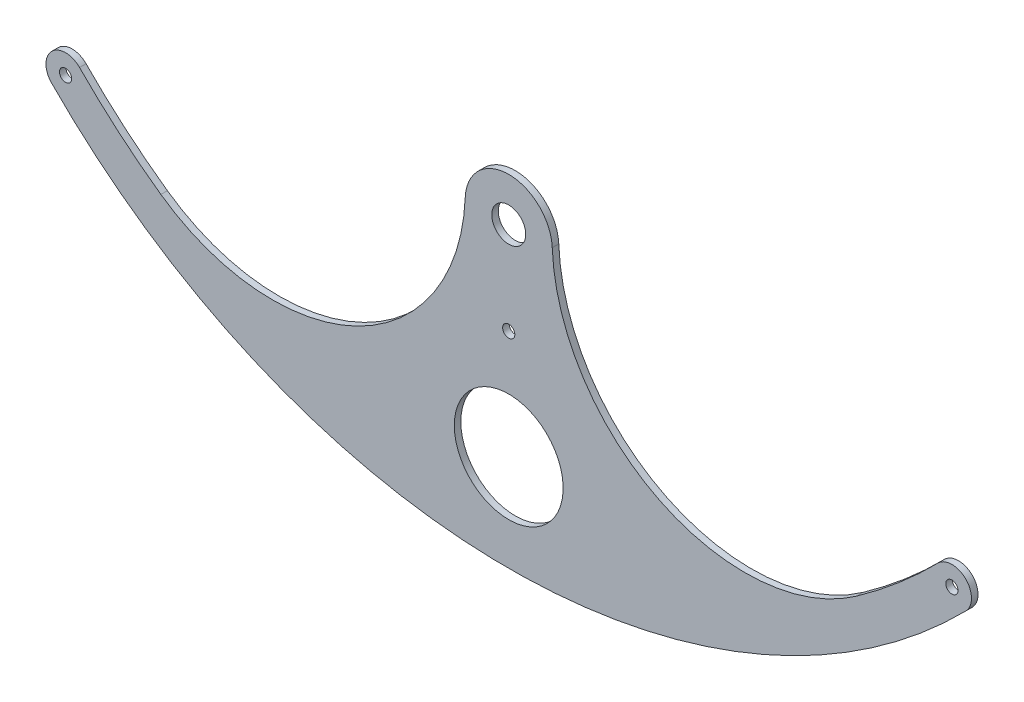
ISO-10303-21;
HEADER;
FILE_DESCRIPTION(('STEP AP214'),'2;1');
FILE_NAME('part.step','',(''),(''),'','','');
FILE_SCHEMA(('AUTOMOTIVE_DESIGN { 1 0 10303 214 1 1 1 1 }'));
ENDSEC;
DATA;
#1=APPLICATION_CONTEXT('core data for automotive mechanical design processes');
#2=APPLICATION_PROTOCOL_DEFINITION('international standard','automotive_design',2000,#1);
#3=PRODUCT_CONTEXT('',#1,'mechanical');
#4=PRODUCT('Part','Part','',(#3));
#5=PRODUCT_RELATED_PRODUCT_CATEGORY('part','',(#4));
#6=PRODUCT_DEFINITION_FORMATION('','',#4);
#7=PRODUCT_DEFINITION_CONTEXT('part definition',#1,'design');
#8=PRODUCT_DEFINITION('design','',#6,#7);
#9=PRODUCT_DEFINITION_SHAPE('','',#8);
#10=(LENGTH_UNIT() NAMED_UNIT(*) SI_UNIT(.MILLI.,.METRE.));
#11=(NAMED_UNIT(*) PLANE_ANGLE_UNIT() SI_UNIT($,.RADIAN.));
#12=(NAMED_UNIT(*) SI_UNIT($,.STERADIAN.) SOLID_ANGLE_UNIT());
#13=UNCERTAINTY_MEASURE_WITH_UNIT(LENGTH_MEASURE(1.E-05),#10,'distance_accuracy_value','');
#14=(GEOMETRIC_REPRESENTATION_CONTEXT(3) GLOBAL_UNCERTAINTY_ASSIGNED_CONTEXT((#13)) GLOBAL_UNIT_ASSIGNED_CONTEXT((#10,
#11,#12)) REPRESENTATION_CONTEXT('',''));
#15=CARTESIAN_POINT('',(0.,0.,0.));
#16=DIRECTION('',(0.,0.,1.));
#17=DIRECTION('',(1.,0.,0.));
#18=AXIS2_PLACEMENT_3D('',#15,#16,#17);
#19=CARTESIAN_POINT('',(0.,127.,1.905));
#20=DIRECTION('',(0.,0.,-1.));
#21=DIRECTION('',(-1.,0.,0.));
#22=AXIS2_PLACEMENT_3D('',#19,#20,#21);
#23=CYLINDRICAL_SURFACE('',#22,175.513777505119);
#24=CARTESIAN_POINT('',(0.,127.,0.));
#25=DIRECTION('',(0.,0.,1.));
#26=DIRECTION('',(1.,0.,0.));
#27=AXIS2_PLACEMENT_3D('',#24,#25,#26);
#28=CIRCLE('',#27,175.513777505119);
#29=CARTESIAN_POINT('',(101.478252071393,-16.2035280663547,0.));
#30=VERTEX_POINT('',#29);
#31=CARTESIAN_POINT('',(125.209001301605,4.00491031276475,0.));
#32=VERTEX_POINT('',#31);
#33=EDGE_CURVE('E152',#30,#32,#28,.T.);
#34=ORIENTED_EDGE('',*,*,#33,.F.);
#35=DIRECTION('',(0.,0.,-1.));
#36=VECTOR('',#35,1.);
#37=CARTESIAN_POINT('',(101.478252071393,-16.2035280663547,1.905));
#38=LINE('',#37,#36);
#39=CARTESIAN_POINT('',(101.478252071393,-16.2035280663547,1.905));
#40=VERTEX_POINT('',#39);
#41=EDGE_CURVE('E11',#40,#30,#38,.T.);
#42=ORIENTED_EDGE('',*,*,#41,.F.);
#43=CARTESIAN_POINT('',(0.,127.,1.905));
#44=DIRECTION('',(0.,0.,1.));
#45=DIRECTION('',(1.,0.,0.));
#46=AXIS2_PLACEMENT_3D('',#43,#44,#45);
#47=CIRCLE('',#46,175.513777505119);
#48=CARTESIAN_POINT('',(125.209001301605,4.00491031276475,1.905));
#49=VERTEX_POINT('',#48);
#50=EDGE_CURVE('E246',#40,#49,#47,.T.);
#51=ORIENTED_EDGE('',*,*,#50,.T.);
#52=DIRECTION('',(0.,0.,-1.));
#53=VECTOR('',#52,1.);
#54=CARTESIAN_POINT('',(125.209001301605,4.00491031276475,1.905));
#55=LINE('',#54,#53);
#56=EDGE_CURVE('E86',#49,#32,#55,.T.);
#57=ORIENTED_EDGE('',*,*,#56,.T.);
#58=EDGE_LOOP('',(#34,#42,#51,#57));
#59=FACE_BOUND('',#58,.T.);
#60=ADVANCED_FACE('F35',(#59),#23,.F.);
#61=CARTESIAN_POINT('',(68.9328054540609,29.7237783560926,1.905));
#62=DIRECTION('',(0.,0.,-1.));
#63=DIRECTION('',(-1.,0.,0.));
#64=AXIS2_PLACEMENT_3D('',#61,#62,#63);
#65=CYLINDRICAL_SURFACE('',#64,56.2896399947894);
#66=CARTESIAN_POINT('',(68.9328054540609,29.7237783560926,0.));
#67=DIRECTION('',(0.,0.,1.));
#68=DIRECTION('',(1.,0.,0.));
#69=AXIS2_PLACEMENT_3D('',#66,#67,#68);
#70=CIRCLE('',#69,56.2896399947894);
#71=CARTESIAN_POINT('',(12.6895375788697,27.4393989080833,0.));
#72=VERTEX_POINT('',#71);
#73=EDGE_CURVE('E150',#30,#72,#70,.F.);
#74=ORIENTED_EDGE('',*,*,#73,.T.);
#75=DIRECTION('',(0.,0.,-1.));
#76=VECTOR('',#75,1.);
#77=CARTESIAN_POINT('',(12.6895375788697,27.4393989080833,1.905));
#78=LINE('',#77,#76);
#79=CARTESIAN_POINT('',(12.6895375788697,27.4393989080833,1.905));
#80=VERTEX_POINT('',#79);
#81=EDGE_CURVE('E44',#80,#72,#78,.T.);
#82=ORIENTED_EDGE('',*,*,#81,.F.);
#83=CARTESIAN_POINT('',(68.9328054540609,29.7237783560926,1.905));
#84=DIRECTION('',(0.,0.,1.));
#85=DIRECTION('',(1.,0.,0.));
#86=AXIS2_PLACEMENT_3D('',#83,#84,#85);
#87=CIRCLE('',#86,56.2896399947894);
#88=EDGE_CURVE('E248',#40,#80,#87,.F.);
#89=ORIENTED_EDGE('',*,*,#88,.F.);
#90=ORIENTED_EDGE('',*,*,#41,.T.);
#91=EDGE_LOOP('',(#74,#82,#89,#90));
#92=FACE_BOUND('',#91,.T.);
#93=ADVANCED_FACE('F151',(#92),#65,.F.);
#94=CARTESIAN_POINT('',(0.,26.924,1.905));
#95=DIRECTION('',(0.,0.,-1.));
#96=DIRECTION('',(-1.,0.,0.));
#97=AXIS2_PLACEMENT_3D('',#94,#95,#96);
#98=CYLINDRICAL_SURFACE('',#97,12.7);
#99=CARTESIAN_POINT('',(0.,26.924,0.));
#100=DIRECTION('',(0.,0.,1.));
#101=DIRECTION('',(1.,0.,0.));
#102=AXIS2_PLACEMENT_3D('',#99,#100,#101);
#103=CIRCLE('',#102,12.7);
#104=CARTESIAN_POINT('',(-12.6895375788697,27.4393989080833,0.));
#105=VERTEX_POINT('',#104);
#106=EDGE_CURVE('E144',#72,#105,#103,.T.);
#107=ORIENTED_EDGE('',*,*,#106,.T.);
#108=DIRECTION('',(0.,0.,-1.));
#109=VECTOR('',#108,1.);
#110=CARTESIAN_POINT('',(-12.6895375788697,27.4393989080833,1.905));
#111=LINE('',#110,#109);
#112=CARTESIAN_POINT('',(-12.6895375788697,27.4393989080833,1.905));
#113=VERTEX_POINT('',#112);
#114=EDGE_CURVE('E136',#113,#105,#111,.T.);
#115=ORIENTED_EDGE('',*,*,#114,.F.);
#116=CARTESIAN_POINT('',(0.,26.924,1.905));
#117=DIRECTION('',(0.,0.,1.));
#118=DIRECTION('',(1.,0.,0.));
#119=AXIS2_PLACEMENT_3D('',#116,#117,#118);
#120=CIRCLE('',#119,12.7);
#121=EDGE_CURVE('E146',#80,#113,#120,.T.);
#122=ORIENTED_EDGE('',*,*,#121,.F.);
#123=ORIENTED_EDGE('',*,*,#81,.T.);
#124=EDGE_LOOP('',(#107,#115,#122,#123));
#125=FACE_BOUND('',#124,.T.);
#126=ADVANCED_FACE('F142',(#125),#98,.T.);
#127=CARTESIAN_POINT('',(-68.9328054540609,29.7237783560926,1.905));
#128=DIRECTION('',(0.,0.,-1.));
#129=DIRECTION('',(-1.,0.,0.));
#130=AXIS2_PLACEMENT_3D('',#127,#128,#129);
#131=CYLINDRICAL_SURFACE('',#130,56.2896399947894);
#132=CARTESIAN_POINT('',(-68.9328054540609,29.7237783560926,0.));
#133=DIRECTION('',(0.,0.,1.));
#134=DIRECTION('',(1.,0.,0.));
#135=AXIS2_PLACEMENT_3D('',#132,#133,#134);
#136=CIRCLE('',#135,56.2896399947894);
#137=CARTESIAN_POINT('',(-101.478252071393,-16.2035280663547,0.));
#138=VERTEX_POINT('',#137);
#139=EDGE_CURVE('E154',#138,#105,#136,.T.);
#140=ORIENTED_EDGE('',*,*,#139,.F.);
#141=DIRECTION('',(0.,0.,-1.));
#142=VECTOR('',#141,1.);
#143=CARTESIAN_POINT('',(-101.478252071393,-16.2035280663547,1.905));
#144=LINE('',#143,#142);
#145=CARTESIAN_POINT('',(-101.478252071393,-16.2035280663547,1.905));
#146=VERTEX_POINT('',#145);
#147=EDGE_CURVE('E130',#146,#138,#144,.T.);
#148=ORIENTED_EDGE('',*,*,#147,.F.);
#149=CARTESIAN_POINT('',(-68.9328054540609,29.7237783560926,1.905));
#150=DIRECTION('',(0.,0.,1.));
#151=DIRECTION('',(1.,0.,0.));
#152=AXIS2_PLACEMENT_3D('',#149,#150,#151);
#153=CIRCLE('',#152,56.2896399947894);
#154=EDGE_CURVE('E253',#146,#113,#153,.T.);
#155=ORIENTED_EDGE('',*,*,#154,.T.);
#156=ORIENTED_EDGE('',*,*,#114,.T.);
#157=EDGE_LOOP('',(#140,#148,#155,#156));
#158=FACE_BOUND('',#157,.T.);
#159=ADVANCED_FACE('F216',(#158),#131,.F.);
#160=CARTESIAN_POINT('',(0.,127.,1.905));
#161=DIRECTION('',(0.,0.,-1.));
#162=DIRECTION('',(-1.,0.,0.));
#163=AXIS2_PLACEMENT_3D('',#160,#161,#162);
#164=CYLINDRICAL_SURFACE('',#163,175.513777505119);
#165=CARTESIAN_POINT('',(0.,127.,0.));
#166=DIRECTION('',(0.,0.,1.));
#167=DIRECTION('',(1.,0.,0.));
#168=AXIS2_PLACEMENT_3D('',#165,#166,#167);
#169=CIRCLE('',#168,175.513777505119);
#170=CARTESIAN_POINT('',(-125.209001301605,4.00491031276475,0.));
#171=VERTEX_POINT('',#170);
#172=EDGE_CURVE('E161',#171,#138,#169,.T.);
#173=ORIENTED_EDGE('',*,*,#172,.F.);
#174=DIRECTION('',(0.,0.,-1.));
#175=VECTOR('',#174,1.);
#176=CARTESIAN_POINT('',(-125.209001301605,4.00491031276475,1.905));
#177=LINE('',#176,#175);
#178=CARTESIAN_POINT('',(-125.209001301605,4.00491031276475,1.905));
#179=VERTEX_POINT('',#178);
#180=EDGE_CURVE('E128',#179,#171,#177,.T.);
#181=ORIENTED_EDGE('',*,*,#180,.F.);
#182=CARTESIAN_POINT('',(0.,127.,1.905));
#183=DIRECTION('',(0.,0.,1.));
#184=DIRECTION('',(1.,0.,0.));
#185=AXIS2_PLACEMENT_3D('',#182,#183,#184);
#186=CIRCLE('',#185,175.513777505119);
#187=EDGE_CURVE('E122',#179,#146,#186,.T.);
#188=ORIENTED_EDGE('',*,*,#187,.T.);
#189=ORIENTED_EDGE('',*,*,#147,.T.);
#190=EDGE_LOOP('',(#173,#181,#188,#189));
#191=FACE_BOUND('',#190,.T.);
#192=ADVANCED_FACE('F219',(#191),#164,.F.);
#193=CARTESIAN_POINT('',(-129.286,0.,1.905));
#194=DIRECTION('',(0.,0.,-1.));
#195=DIRECTION('',(-1.,0.,0.));
#196=AXIS2_PLACEMENT_3D('',#193,#194,#195);
#197=CYLINDRICAL_SURFACE('',#196,5.71499999999999);
#198=CARTESIAN_POINT('',(-129.286,0.,0.));
#199=DIRECTION('',(0.,0.,1.));
#200=DIRECTION('',(1.,0.,0.));
#201=AXIS2_PLACEMENT_3D('',#198,#199,#200);
#202=CIRCLE('',#201,5.71499999999999);
#203=CARTESIAN_POINT('',(-133.362998698394,-4.00491031276475,0.));
#204=VERTEX_POINT('',#203);
#205=EDGE_CURVE('E127',#171,#204,#202,.T.);
#206=ORIENTED_EDGE('',*,*,#205,.T.);
#207=DIRECTION('',(0.,0.,-1.));
#208=VECTOR('',#207,1.);
#209=CARTESIAN_POINT('',(-133.362998698394,-4.00491031276475,1.905));
#210=LINE('',#209,#208);
#211=CARTESIAN_POINT('',(-133.362998698394,-4.00491031276475,1.905));
#212=VERTEX_POINT('',#211);
#213=EDGE_CURVE('E111',#212,#204,#210,.T.);
#214=ORIENTED_EDGE('',*,*,#213,.F.);
#215=CARTESIAN_POINT('',(-129.286,0.,1.905));
#216=DIRECTION('',(0.,0.,1.));
#217=DIRECTION('',(1.,0.,0.));
#218=AXIS2_PLACEMENT_3D('',#215,#216,#217);
#219=CIRCLE('',#218,5.71499999999999);
#220=EDGE_CURVE('E114',#179,#212,#219,.T.);
#221=ORIENTED_EDGE('',*,*,#220,.F.);
#222=ORIENTED_EDGE('',*,*,#180,.T.);
#223=EDGE_LOOP('',(#206,#214,#221,#222));
#224=FACE_BOUND('',#223,.T.);
#225=ADVANCED_FACE('F125',(#224),#197,.T.);
#226=CARTESIAN_POINT('',(0.,127.,1.905));
#227=DIRECTION('',(0.,0.,-1.));
#228=DIRECTION('',(-1.,0.,0.));
#229=AXIS2_PLACEMENT_3D('',#226,#227,#228);
#230=CYLINDRICAL_SURFACE('',#229,186.943777505119);
#231=CARTESIAN_POINT('',(0.,127.,0.));
#232=DIRECTION('',(0.,0.,1.));
#233=DIRECTION('',(1.,0.,0.));
#234=AXIS2_PLACEMENT_3D('',#231,#232,#233);
#235=CIRCLE('',#234,186.943777505119);
#236=CARTESIAN_POINT('',(133.362998698394,-4.00491031276475,0.));
#237=VERTEX_POINT('',#236);
#238=EDGE_CURVE('E165',#204,#237,#235,.T.);
#239=ORIENTED_EDGE('',*,*,#238,.T.);
#240=DIRECTION('',(0.,0.,-1.));
#241=VECTOR('',#240,1.);
#242=CARTESIAN_POINT('',(133.362998698394,-4.00491031276475,1.905));
#243=LINE('',#242,#241);
#244=CARTESIAN_POINT('',(133.362998698394,-4.00491031276475,1.905));
#245=VERTEX_POINT('',#244);
#246=EDGE_CURVE('E113',#245,#237,#243,.T.);
#247=ORIENTED_EDGE('',*,*,#246,.F.);
#248=CARTESIAN_POINT('',(0.,127.,1.905));
#249=DIRECTION('',(0.,0.,1.));
#250=DIRECTION('',(1.,0.,0.));
#251=AXIS2_PLACEMENT_3D('',#248,#249,#250);
#252=CIRCLE('',#251,186.943777505119);
#253=EDGE_CURVE('E106',#212,#245,#252,.T.);
#254=ORIENTED_EDGE('',*,*,#253,.F.);
#255=ORIENTED_EDGE('',*,*,#213,.T.);
#256=EDGE_LOOP('',(#239,#247,#254,#255));
#257=FACE_BOUND('',#256,.T.);
#258=ADVANCED_FACE('F109',(#257),#230,.T.);
#259=CARTESIAN_POINT('',(129.286,0.,1.905));
#260=DIRECTION('',(0.,0.,-1.));
#261=DIRECTION('',(-1.,0.,0.));
#262=AXIS2_PLACEMENT_3D('',#259,#260,#261);
#263=CYLINDRICAL_SURFACE('',#262,1.77800000000001);
#264=CARTESIAN_POINT('',(129.286,0.,1.905));
#265=DIRECTION('',(0.,0.,1.));
#266=DIRECTION('',(1.,0.,0.));
#267=AXIS2_PLACEMENT_3D('',#264,#265,#266);
#268=CIRCLE('',#267,1.77800000000001);
#269=CARTESIAN_POINT('',(127.508,0.,1.905));
#270=VERTEX_POINT('',#269);
#271=EDGE_CURVE('E182',#270,#270,#268,.T.);
#272=CARTESIAN_POINT('',(129.286,0.,0.));
#273=DIRECTION('',(0.,0.,1.));
#274=DIRECTION('',(1.,0.,0.));
#275=AXIS2_PLACEMENT_3D('',#272,#273,#274);
#276=CIRCLE('',#275,1.77800000000001);
#277=CARTESIAN_POINT('',(127.508,0.,0.));
#278=VERTEX_POINT('',#277);
#279=EDGE_CURVE('E174',#278,#278,#276,.T.);
#280=CARTESIAN_POINT('',(127.508,0.,1.905));
#281=CARTESIAN_POINT('',(127.508,0.,1.88515625));
#282=CARTESIAN_POINT('',(127.508,0.,1.8653125));
#283=CARTESIAN_POINT('',(127.508,0.,1.825625));
#284=CARTESIAN_POINT('',(127.508,0.,1.80578125));
#285=CARTESIAN_POINT('',(127.508,0.,1.76609375));
#286=CARTESIAN_POINT('',(127.508,0.,1.74625));
#287=CARTESIAN_POINT('',(127.508,0.,1.7065625));
#288=CARTESIAN_POINT('',(127.508,0.,1.68671875));
#289=CARTESIAN_POINT('',(127.508,0.,1.64703125));
#290=CARTESIAN_POINT('',(127.508,0.,1.6271875));
#291=CARTESIAN_POINT('',(127.508,0.,1.5875));
#292=CARTESIAN_POINT('',(127.508,0.,1.56765625));
#293=CARTESIAN_POINT('',(127.508,0.,1.52796875));
#294=CARTESIAN_POINT('',(127.508,0.,1.508125));
#295=CARTESIAN_POINT('',(127.508,0.,1.4684375));
#296=CARTESIAN_POINT('',(127.508,0.,1.44859375));
#297=CARTESIAN_POINT('',(127.508,0.,1.40890625));
#298=CARTESIAN_POINT('',(127.508,0.,1.3890625));
#299=CARTESIAN_POINT('',(127.508,0.,1.349375));
#300=CARTESIAN_POINT('',(127.508,0.,1.32953125));
#301=CARTESIAN_POINT('',(127.508,0.,1.28984375));
#302=CARTESIAN_POINT('',(127.508,0.,1.27));
#303=CARTESIAN_POINT('',(127.508,0.,1.2303125));
#304=CARTESIAN_POINT('',(127.508,0.,1.21046875));
#305=CARTESIAN_POINT('',(127.508,0.,1.17078125));
#306=CARTESIAN_POINT('',(127.508,0.,1.1509375));
#307=CARTESIAN_POINT('',(127.508,0.,1.11125));
#308=CARTESIAN_POINT('',(127.508,0.,1.09140625));
#309=CARTESIAN_POINT('',(127.508,0.,1.05171875));
#310=CARTESIAN_POINT('',(127.508,0.,1.031875));
#311=CARTESIAN_POINT('',(127.508,0.,0.9921875));
#312=CARTESIAN_POINT('',(127.508,0.,0.97234375));
#313=CARTESIAN_POINT('',(127.508,0.,0.93265625));
#314=CARTESIAN_POINT('',(127.508,0.,0.9128125));
#315=CARTESIAN_POINT('',(127.508,0.,0.873125));
#316=CARTESIAN_POINT('',(127.508,0.,0.85328125));
#317=CARTESIAN_POINT('',(127.508,0.,0.81359375));
#318=CARTESIAN_POINT('',(127.508,0.,0.79375));
#319=CARTESIAN_POINT('',(127.508,0.,0.7540625));
#320=CARTESIAN_POINT('',(127.508,0.,0.73421875));
#321=CARTESIAN_POINT('',(127.508,0.,0.69453125));
#322=CARTESIAN_POINT('',(127.508,0.,0.6746875));
#323=CARTESIAN_POINT('',(127.508,0.,0.635));
#324=CARTESIAN_POINT('',(127.508,0.,0.61515625));
#325=CARTESIAN_POINT('',(127.508,0.,0.57546875));
#326=CARTESIAN_POINT('',(127.508,0.,0.555625));
#327=CARTESIAN_POINT('',(127.508,0.,0.5159375));
#328=CARTESIAN_POINT('',(127.508,0.,0.49609375));
#329=CARTESIAN_POINT('',(127.508,0.,0.45640625));
#330=CARTESIAN_POINT('',(127.508,0.,0.4365625));
#331=CARTESIAN_POINT('',(127.508,0.,0.396875));
#332=CARTESIAN_POINT('',(127.508,0.,0.37703125));
#333=CARTESIAN_POINT('',(127.508,0.,0.33734375));
#334=CARTESIAN_POINT('',(127.508,0.,0.3175));
#335=CARTESIAN_POINT('',(127.508,0.,0.2778125));
#336=CARTESIAN_POINT('',(127.508,0.,0.25796875));
#337=CARTESIAN_POINT('',(127.508,0.,0.21828125));
#338=CARTESIAN_POINT('',(127.508,0.,0.1984375));
#339=CARTESIAN_POINT('',(127.508,0.,0.15875));
#340=CARTESIAN_POINT('',(127.508,0.,0.13890625));
#341=CARTESIAN_POINT('',(127.508,0.,0.09921875));
#342=CARTESIAN_POINT('',(127.508,0.,0.0793749999999999));
#343=CARTESIAN_POINT('',(127.508,0.,0.0396874999999999));
#344=CARTESIAN_POINT('',(127.508,0.,0.01984375));
#345=CARTESIAN_POINT('',(127.508,0.,0.));
#346=B_SPLINE_CURVE_WITH_KNOTS('',3,(#280,#281,#282,#283,#284,#285,#286,#287,#288,#289,#290,
#291,#292,#293,#294,#295,#296,#297,#298,#299,#300,#301,#302,#303,#304,#305,#306,#307,#308,#309,
#310,#311,#312,#313,#314,#315,#316,#317,#318,#319,#320,#321,#322,#323,#324,#325,#326,#327,#328,
#329,#330,#331,#332,#333,#334,#335,#336,#337,#338,#339,#340,#341,#342,#343,#344,#345),
.UNSPECIFIED.,.F.,.F.,(4,2,2,2,2,2,2,2,2,2,2,2,2,2,2,2,2,2,2,2,2,2,2,2,2,2,2,2,2,2,2,2,4),(0.,
0.0595312499999999,0.1190625,0.17859375,0.238125,0.29765625,0.3571875,0.41671875,0.47625,
0.53578125,0.5953125,0.65484375,0.714375,0.77390625,0.833437499999999,0.89296875,0.9525,
1.01203125,1.0715625,1.13109375,1.190625,1.25015625,1.3096875,1.36921875,1.42875,1.48828125,
1.5478125,1.60734375,1.666875,1.72640625,1.7859375,1.84546875,1.905),.UNSPECIFIED.);
#347=EDGE_CURVE('BSEAM227',#270,#278,#346,.T.);
#348=ORIENTED_EDGE('',*,*,#271,.T.);
#349=ORIENTED_EDGE('',*,*,#279,.F.);
#350=ORIENTED_EDGE('',*,*,#347,.T.);
#351=ORIENTED_EDGE('',*,*,#347,.F.);
#352=EDGE_LOOP('',(#348,#350,#349,#351));
#353=FACE_BOUND('',#352,.T.);
#354=ADVANCED_FACE('F227',(#353),#263,.F.);
#355=CARTESIAN_POINT('',(-129.286,0.,1.905));
#356=DIRECTION('',(0.,0.,-1.));
#357=DIRECTION('',(-1.,0.,0.));
#358=AXIS2_PLACEMENT_3D('',#355,#356,#357);
#359=CYLINDRICAL_SURFACE('',#358,1.77800000000001);
#360=CARTESIAN_POINT('',(-129.286,0.,1.905));
#361=DIRECTION('',(0.,0.,1.));
#362=DIRECTION('',(1.,0.,0.));
#363=AXIS2_PLACEMENT_3D('',#360,#361,#362);
#364=CIRCLE('',#363,1.77800000000001);
#365=CARTESIAN_POINT('',(-131.064,0.,1.905));
#366=VERTEX_POINT('',#365);
#367=EDGE_CURVE('E187',#366,#366,#364,.T.);
#368=CARTESIAN_POINT('',(-129.286,0.,0.));
#369=DIRECTION('',(0.,0.,1.));
#370=DIRECTION('',(1.,0.,0.));
#371=AXIS2_PLACEMENT_3D('',#368,#369,#370);
#372=CIRCLE('',#371,1.77800000000001);
#373=CARTESIAN_POINT('',(-131.064,0.,0.));
#374=VERTEX_POINT('',#373);
#375=EDGE_CURVE('E171',#374,#374,#372,.T.);
#376=CARTESIAN_POINT('',(-131.064,0.,1.905));
#377=CARTESIAN_POINT('',(-131.064,0.,1.88515625));
#378=CARTESIAN_POINT('',(-131.064,0.,1.8653125));
#379=CARTESIAN_POINT('',(-131.064,0.,1.825625));
#380=CARTESIAN_POINT('',(-131.064,0.,1.80578125));
#381=CARTESIAN_POINT('',(-131.064,0.,1.76609375));
#382=CARTESIAN_POINT('',(-131.064,0.,1.74625));
#383=CARTESIAN_POINT('',(-131.064,0.,1.7065625));
#384=CARTESIAN_POINT('',(-131.064,0.,1.68671875));
#385=CARTESIAN_POINT('',(-131.064,0.,1.64703125));
#386=CARTESIAN_POINT('',(-131.064,0.,1.6271875));
#387=CARTESIAN_POINT('',(-131.064,0.,1.5875));
#388=CARTESIAN_POINT('',(-131.064,0.,1.56765625));
#389=CARTESIAN_POINT('',(-131.064,0.,1.52796875));
#390=CARTESIAN_POINT('',(-131.064,0.,1.508125));
#391=CARTESIAN_POINT('',(-131.064,0.,1.4684375));
#392=CARTESIAN_POINT('',(-131.064,0.,1.44859375));
#393=CARTESIAN_POINT('',(-131.064,0.,1.40890625));
#394=CARTESIAN_POINT('',(-131.064,0.,1.3890625));
#395=CARTESIAN_POINT('',(-131.064,0.,1.349375));
#396=CARTESIAN_POINT('',(-131.064,0.,1.32953125));
#397=CARTESIAN_POINT('',(-131.064,0.,1.28984375));
#398=CARTESIAN_POINT('',(-131.064,0.,1.27));
#399=CARTESIAN_POINT('',(-131.064,0.,1.2303125));
#400=CARTESIAN_POINT('',(-131.064,0.,1.21046875));
#401=CARTESIAN_POINT('',(-131.064,0.,1.17078125));
#402=CARTESIAN_POINT('',(-131.064,0.,1.1509375));
#403=CARTESIAN_POINT('',(-131.064,0.,1.11125));
#404=CARTESIAN_POINT('',(-131.064,0.,1.09140625));
#405=CARTESIAN_POINT('',(-131.064,0.,1.05171875));
#406=CARTESIAN_POINT('',(-131.064,0.,1.031875));
#407=CARTESIAN_POINT('',(-131.064,0.,0.9921875));
#408=CARTESIAN_POINT('',(-131.064,0.,0.97234375));
#409=CARTESIAN_POINT('',(-131.064,0.,0.93265625));
#410=CARTESIAN_POINT('',(-131.064,0.,0.9128125));
#411=CARTESIAN_POINT('',(-131.064,0.,0.873125));
#412=CARTESIAN_POINT('',(-131.064,0.,0.85328125));
#413=CARTESIAN_POINT('',(-131.064,0.,0.81359375));
#414=CARTESIAN_POINT('',(-131.064,0.,0.79375));
#415=CARTESIAN_POINT('',(-131.064,0.,0.7540625));
#416=CARTESIAN_POINT('',(-131.064,0.,0.73421875));
#417=CARTESIAN_POINT('',(-131.064,0.,0.69453125));
#418=CARTESIAN_POINT('',(-131.064,0.,0.6746875));
#419=CARTESIAN_POINT('',(-131.064,0.,0.635));
#420=CARTESIAN_POINT('',(-131.064,0.,0.61515625));
#421=CARTESIAN_POINT('',(-131.064,0.,0.57546875));
#422=CARTESIAN_POINT('',(-131.064,0.,0.555625));
#423=CARTESIAN_POINT('',(-131.064,0.,0.5159375));
#424=CARTESIAN_POINT('',(-131.064,0.,0.49609375));
#425=CARTESIAN_POINT('',(-131.064,0.,0.45640625));
#426=CARTESIAN_POINT('',(-131.064,0.,0.4365625));
#427=CARTESIAN_POINT('',(-131.064,0.,0.396875));
#428=CARTESIAN_POINT('',(-131.064,0.,0.37703125));
#429=CARTESIAN_POINT('',(-131.064,0.,0.33734375));
#430=CARTESIAN_POINT('',(-131.064,0.,0.3175));
#431=CARTESIAN_POINT('',(-131.064,0.,0.2778125));
#432=CARTESIAN_POINT('',(-131.064,0.,0.25796875));
#433=CARTESIAN_POINT('',(-131.064,0.,0.21828125));
#434=CARTESIAN_POINT('',(-131.064,0.,0.1984375));
#435=CARTESIAN_POINT('',(-131.064,0.,0.15875));
#436=CARTESIAN_POINT('',(-131.064,0.,0.13890625));
#437=CARTESIAN_POINT('',(-131.064,0.,0.09921875));
#438=CARTESIAN_POINT('',(-131.064,0.,0.0793749999999999));
#439=CARTESIAN_POINT('',(-131.064,0.,0.0396874999999999));
#440=CARTESIAN_POINT('',(-131.064,0.,0.01984375));
#441=CARTESIAN_POINT('',(-131.064,0.,0.));
#442=B_SPLINE_CURVE_WITH_KNOTS('',3,(#376,#377,#378,#379,#380,#381,#382,#383,#384,#385,#386,
#387,#388,#389,#390,#391,#392,#393,#394,#395,#396,#397,#398,#399,#400,#401,#402,#403,#404,#405,
#406,#407,#408,#409,#410,#411,#412,#413,#414,#415,#416,#417,#418,#419,#420,#421,#422,#423,#424,
#425,#426,#427,#428,#429,#430,#431,#432,#433,#434,#435,#436,#437,#438,#439,#440,#441),
.UNSPECIFIED.,.F.,.F.,(4,2,2,2,2,2,2,2,2,2,2,2,2,2,2,2,2,2,2,2,2,2,2,2,2,2,2,2,2,2,2,2,4),(0.,
0.0595312499999999,0.1190625,0.17859375,0.238125,0.29765625,0.3571875,0.41671875,0.47625,
0.53578125,0.5953125,0.65484375,0.714375,0.77390625,0.833437499999999,0.89296875,0.9525,
1.01203125,1.0715625,1.13109375,1.190625,1.25015625,1.3096875,1.36921875,1.42875,1.48828125,
1.5478125,1.60734375,1.666875,1.72640625,1.7859375,1.84546875,1.905),.UNSPECIFIED.);
#443=EDGE_CURVE('BSEAM231',#366,#374,#442,.T.);
#444=ORIENTED_EDGE('',*,*,#367,.T.);
#445=ORIENTED_EDGE('',*,*,#375,.F.);
#446=ORIENTED_EDGE('',*,*,#443,.T.);
#447=ORIENTED_EDGE('',*,*,#443,.F.);
#448=EDGE_LOOP('',(#444,#446,#445,#447));
#449=FACE_BOUND('',#448,.T.);
#450=ADVANCED_FACE('F231',(#449),#359,.F.);
#451=CARTESIAN_POINT('',(0.,26.924,1.905));
#452=DIRECTION('',(0.,0.,-1.));
#453=DIRECTION('',(-1.,0.,0.));
#454=AXIS2_PLACEMENT_3D('',#451,#452,#453);
#455=CYLINDRICAL_SURFACE('',#454,4.953);
#456=CARTESIAN_POINT('',(0.,26.924,1.905));
#457=DIRECTION('',(0.,0.,1.));
#458=DIRECTION('',(1.,0.,0.));
#459=AXIS2_PLACEMENT_3D('',#456,#457,#458);
#460=CIRCLE('',#459,4.953);
#461=CARTESIAN_POINT('',(-4.953,26.924,1.905));
#462=VERTEX_POINT('',#461);
#463=EDGE_CURVE('E258',#462,#462,#460,.T.);
#464=CARTESIAN_POINT('',(0.,26.924,0.));
#465=DIRECTION('',(0.,0.,1.));
#466=DIRECTION('',(1.,0.,0.));
#467=AXIS2_PLACEMENT_3D('',#464,#465,#466);
#468=CIRCLE('',#467,4.953);
#469=CARTESIAN_POINT('',(-4.953,26.924,0.));
#470=VERTEX_POINT('',#469);
#471=EDGE_CURVE('E168',#470,#470,#468,.T.);
#472=CARTESIAN_POINT('',(-4.953,26.924,1.905));
#473=CARTESIAN_POINT('',(-4.953,26.924,1.88515625));
#474=CARTESIAN_POINT('',(-4.953,26.924,1.8653125));
#475=CARTESIAN_POINT('',(-4.953,26.924,1.825625));
#476=CARTESIAN_POINT('',(-4.953,26.924,1.80578125));
#477=CARTESIAN_POINT('',(-4.953,26.924,1.76609375));
#478=CARTESIAN_POINT('',(-4.953,26.924,1.74625));
#479=CARTESIAN_POINT('',(-4.953,26.924,1.7065625));
#480=CARTESIAN_POINT('',(-4.953,26.924,1.68671875));
#481=CARTESIAN_POINT('',(-4.953,26.924,1.64703125));
#482=CARTESIAN_POINT('',(-4.953,26.924,1.6271875));
#483=CARTESIAN_POINT('',(-4.953,26.924,1.5875));
#484=CARTESIAN_POINT('',(-4.953,26.924,1.56765625));
#485=CARTESIAN_POINT('',(-4.953,26.924,1.52796875));
#486=CARTESIAN_POINT('',(-4.953,26.924,1.508125));
#487=CARTESIAN_POINT('',(-4.953,26.924,1.4684375));
#488=CARTESIAN_POINT('',(-4.953,26.924,1.44859375));
#489=CARTESIAN_POINT('',(-4.953,26.924,1.40890625));
#490=CARTESIAN_POINT('',(-4.953,26.924,1.3890625));
#491=CARTESIAN_POINT('',(-4.953,26.924,1.349375));
#492=CARTESIAN_POINT('',(-4.953,26.924,1.32953125));
#493=CARTESIAN_POINT('',(-4.953,26.924,1.28984375));
#494=CARTESIAN_POINT('',(-4.953,26.924,1.27));
#495=CARTESIAN_POINT('',(-4.953,26.924,1.2303125));
#496=CARTESIAN_POINT('',(-4.953,26.924,1.21046875));
#497=CARTESIAN_POINT('',(-4.953,26.924,1.17078125));
#498=CARTESIAN_POINT('',(-4.953,26.924,1.1509375));
#499=CARTESIAN_POINT('',(-4.953,26.924,1.11125));
#500=CARTESIAN_POINT('',(-4.953,26.924,1.09140625));
#501=CARTESIAN_POINT('',(-4.953,26.924,1.05171875));
#502=CARTESIAN_POINT('',(-4.953,26.924,1.031875));
#503=CARTESIAN_POINT('',(-4.953,26.924,0.9921875));
#504=CARTESIAN_POINT('',(-4.953,26.924,0.97234375));
#505=CARTESIAN_POINT('',(-4.953,26.924,0.93265625));
#506=CARTESIAN_POINT('',(-4.953,26.924,0.9128125));
#507=CARTESIAN_POINT('',(-4.953,26.924,0.873125));
#508=CARTESIAN_POINT('',(-4.953,26.924,0.85328125));
#509=CARTESIAN_POINT('',(-4.953,26.924,0.81359375));
#510=CARTESIAN_POINT('',(-4.953,26.924,0.79375));
#511=CARTESIAN_POINT('',(-4.953,26.924,0.7540625));
#512=CARTESIAN_POINT('',(-4.953,26.924,0.73421875));
#513=CARTESIAN_POINT('',(-4.953,26.924,0.69453125));
#514=CARTESIAN_POINT('',(-4.953,26.924,0.6746875));
#515=CARTESIAN_POINT('',(-4.953,26.924,0.635));
#516=CARTESIAN_POINT('',(-4.953,26.924,0.61515625));
#517=CARTESIAN_POINT('',(-4.953,26.924,0.57546875));
#518=CARTESIAN_POINT('',(-4.953,26.924,0.555625));
#519=CARTESIAN_POINT('',(-4.953,26.924,0.5159375));
#520=CARTESIAN_POINT('',(-4.953,26.924,0.49609375));
#521=CARTESIAN_POINT('',(-4.953,26.924,0.45640625));
#522=CARTESIAN_POINT('',(-4.953,26.924,0.4365625));
#523=CARTESIAN_POINT('',(-4.953,26.924,0.396875));
#524=CARTESIAN_POINT('',(-4.953,26.924,0.37703125));
#525=CARTESIAN_POINT('',(-4.953,26.924,0.33734375));
#526=CARTESIAN_POINT('',(-4.953,26.924,0.3175));
#527=CARTESIAN_POINT('',(-4.953,26.924,0.2778125));
#528=CARTESIAN_POINT('',(-4.953,26.924,0.25796875));
#529=CARTESIAN_POINT('',(-4.953,26.924,0.21828125));
#530=CARTESIAN_POINT('',(-4.953,26.924,0.1984375));
#531=CARTESIAN_POINT('',(-4.953,26.924,0.15875));
#532=CARTESIAN_POINT('',(-4.953,26.924,0.13890625));
#533=CARTESIAN_POINT('',(-4.953,26.924,0.09921875));
#534=CARTESIAN_POINT('',(-4.953,26.924,0.0793749999999999));
#535=CARTESIAN_POINT('',(-4.953,26.924,0.0396874999999999));
#536=CARTESIAN_POINT('',(-4.953,26.924,0.01984375));
#537=CARTESIAN_POINT('',(-4.953,26.924,0.));
#538=B_SPLINE_CURVE_WITH_KNOTS('',3,(#472,#473,#474,#475,#476,#477,#478,#479,#480,#481,#482,
#483,#484,#485,#486,#487,#488,#489,#490,#491,#492,#493,#494,#495,#496,#497,#498,#499,#500,#501,
#502,#503,#504,#505,#506,#507,#508,#509,#510,#511,#512,#513,#514,#515,#516,#517,#518,#519,#520,
#521,#522,#523,#524,#525,#526,#527,#528,#529,#530,#531,#532,#533,#534,#535,#536,#537),
.UNSPECIFIED.,.F.,.F.,(4,2,2,2,2,2,2,2,2,2,2,2,2,2,2,2,2,2,2,2,2,2,2,2,2,2,2,2,2,2,2,2,4),(0.,
0.0595312499999999,0.1190625,0.17859375,0.238125,0.29765625,0.3571875,0.41671875,0.47625,
0.53578125,0.5953125,0.65484375,0.714375,0.77390625,0.833437499999999,0.89296875,0.9525,
1.01203125,1.0715625,1.13109375,1.190625,1.25015625,1.3096875,1.36921875,1.42875,1.48828125,
1.5478125,1.60734375,1.666875,1.72640625,1.7859375,1.84546875,1.905),.UNSPECIFIED.);
#539=EDGE_CURVE('BSEAM204',#462,#470,#538,.T.);
#540=ORIENTED_EDGE('',*,*,#463,.T.);
#541=ORIENTED_EDGE('',*,*,#471,.F.);
#542=ORIENTED_EDGE('',*,*,#539,.T.);
#543=ORIENTED_EDGE('',*,*,#539,.F.);
#544=EDGE_LOOP('',(#540,#542,#541,#543));
#545=FACE_BOUND('',#544,.T.);
#546=ADVANCED_FACE('F204',(#545),#455,.F.);
#547=CARTESIAN_POINT('',(129.286,0.,1.905));
#548=DIRECTION('',(0.,0.,-1.));
#549=DIRECTION('',(-1.,0.,0.));
#550=AXIS2_PLACEMENT_3D('',#547,#548,#549);
#551=CYLINDRICAL_SURFACE('',#550,5.715);
#552=CARTESIAN_POINT('',(129.286,0.,0.));
#553=DIRECTION('',(0.,0.,1.));
#554=DIRECTION('',(1.,0.,0.));
#555=AXIS2_PLACEMENT_3D('',#552,#553,#554);
#556=CIRCLE('',#555,5.715);
#557=EDGE_CURVE('E79',#237,#32,#556,.T.);
#558=ORIENTED_EDGE('',*,*,#557,.T.);
#559=ORIENTED_EDGE('',*,*,#56,.F.);
#560=CARTESIAN_POINT('',(129.286,0.,1.905));
#561=DIRECTION('',(0.,0.,1.));
#562=DIRECTION('',(1.,0.,0.));
#563=AXIS2_PLACEMENT_3D('',#560,#561,#562);
#564=CIRCLE('',#563,5.715);
#565=EDGE_CURVE('E52',#245,#49,#564,.T.);
#566=ORIENTED_EDGE('',*,*,#565,.F.);
#567=ORIENTED_EDGE('',*,*,#246,.T.);
#568=EDGE_LOOP('',(#558,#559,#566,#567));
#569=FACE_BOUND('',#568,.T.);
#570=ADVANCED_FACE('F197',(#569),#551,.T.);
#571=CARTESIAN_POINT('',(0.,-31.75,1.905));
#572=DIRECTION('',(0.,0.,-1.));
#573=DIRECTION('',(-1.,0.,0.));
#574=AXIS2_PLACEMENT_3D('',#571,#572,#573);
#575=CYLINDRICAL_SURFACE('',#574,15.875);
#576=CARTESIAN_POINT('',(0.,-31.75,1.905));
#577=DIRECTION('',(0.,0.,1.));
#578=DIRECTION('',(1.,0.,0.));
#579=AXIS2_PLACEMENT_3D('',#576,#577,#578);
#580=CIRCLE('',#579,15.875);
#581=CARTESIAN_POINT('',(-15.875,-31.75,1.905));
#582=VERTEX_POINT('',#581);
#583=EDGE_CURVE('E179',#582,#582,#580,.T.);
#584=CARTESIAN_POINT('',(0.,-31.75,0.));
#585=DIRECTION('',(0.,0.,1.));
#586=DIRECTION('',(1.,0.,0.));
#587=AXIS2_PLACEMENT_3D('',#584,#585,#586);
#588=CIRCLE('',#587,15.875);
#589=CARTESIAN_POINT('',(-15.875,-31.75,0.));
#590=VERTEX_POINT('',#589);
#591=EDGE_CURVE('E156',#590,#590,#588,.T.);
#592=CARTESIAN_POINT('',(-15.875,-31.75,1.905));
#593=CARTESIAN_POINT('',(-15.875,-31.75,1.88515625));
#594=CARTESIAN_POINT('',(-15.875,-31.75,1.8653125));
#595=CARTESIAN_POINT('',(-15.875,-31.75,1.825625));
#596=CARTESIAN_POINT('',(-15.875,-31.75,1.80578125));
#597=CARTESIAN_POINT('',(-15.875,-31.75,1.76609375));
#598=CARTESIAN_POINT('',(-15.875,-31.75,1.74625));
#599=CARTESIAN_POINT('',(-15.875,-31.75,1.7065625));
#600=CARTESIAN_POINT('',(-15.875,-31.75,1.68671875));
#601=CARTESIAN_POINT('',(-15.875,-31.75,1.64703125));
#602=CARTESIAN_POINT('',(-15.875,-31.75,1.6271875));
#603=CARTESIAN_POINT('',(-15.875,-31.75,1.5875));
#604=CARTESIAN_POINT('',(-15.875,-31.75,1.56765625));
#605=CARTESIAN_POINT('',(-15.875,-31.75,1.52796875));
#606=CARTESIAN_POINT('',(-15.875,-31.75,1.508125));
#607=CARTESIAN_POINT('',(-15.875,-31.75,1.4684375));
#608=CARTESIAN_POINT('',(-15.875,-31.75,1.44859375));
#609=CARTESIAN_POINT('',(-15.875,-31.75,1.40890625));
#610=CARTESIAN_POINT('',(-15.875,-31.75,1.3890625));
#611=CARTESIAN_POINT('',(-15.875,-31.75,1.349375));
#612=CARTESIAN_POINT('',(-15.875,-31.75,1.32953125));
#613=CARTESIAN_POINT('',(-15.875,-31.75,1.28984375));
#614=CARTESIAN_POINT('',(-15.875,-31.75,1.27));
#615=CARTESIAN_POINT('',(-15.875,-31.75,1.2303125));
#616=CARTESIAN_POINT('',(-15.875,-31.75,1.21046875));
#617=CARTESIAN_POINT('',(-15.875,-31.75,1.17078125));
#618=CARTESIAN_POINT('',(-15.875,-31.75,1.1509375));
#619=CARTESIAN_POINT('',(-15.875,-31.75,1.11125));
#620=CARTESIAN_POINT('',(-15.875,-31.75,1.09140625));
#621=CARTESIAN_POINT('',(-15.875,-31.75,1.05171875));
#622=CARTESIAN_POINT('',(-15.875,-31.75,1.031875));
#623=CARTESIAN_POINT('',(-15.875,-31.75,0.9921875));
#624=CARTESIAN_POINT('',(-15.875,-31.75,0.97234375));
#625=CARTESIAN_POINT('',(-15.875,-31.75,0.93265625));
#626=CARTESIAN_POINT('',(-15.875,-31.75,0.9128125));
#627=CARTESIAN_POINT('',(-15.875,-31.75,0.873125));
#628=CARTESIAN_POINT('',(-15.875,-31.75,0.85328125));
#629=CARTESIAN_POINT('',(-15.875,-31.75,0.81359375));
#630=CARTESIAN_POINT('',(-15.875,-31.75,0.79375));
#631=CARTESIAN_POINT('',(-15.875,-31.75,0.7540625));
#632=CARTESIAN_POINT('',(-15.875,-31.75,0.73421875));
#633=CARTESIAN_POINT('',(-15.875,-31.75,0.69453125));
#634=CARTESIAN_POINT('',(-15.875,-31.75,0.6746875));
#635=CARTESIAN_POINT('',(-15.875,-31.75,0.635));
#636=CARTESIAN_POINT('',(-15.875,-31.75,0.61515625));
#637=CARTESIAN_POINT('',(-15.875,-31.75,0.57546875));
#638=CARTESIAN_POINT('',(-15.875,-31.75,0.555625));
#639=CARTESIAN_POINT('',(-15.875,-31.75,0.5159375));
#640=CARTESIAN_POINT('',(-15.875,-31.75,0.49609375));
#641=CARTESIAN_POINT('',(-15.875,-31.75,0.45640625));
#642=CARTESIAN_POINT('',(-15.875,-31.75,0.4365625));
#643=CARTESIAN_POINT('',(-15.875,-31.75,0.396875));
#644=CARTESIAN_POINT('',(-15.875,-31.75,0.37703125));
#645=CARTESIAN_POINT('',(-15.875,-31.75,0.33734375));
#646=CARTESIAN_POINT('',(-15.875,-31.75,0.3175));
#647=CARTESIAN_POINT('',(-15.875,-31.75,0.2778125));
#648=CARTESIAN_POINT('',(-15.875,-31.75,0.25796875));
#649=CARTESIAN_POINT('',(-15.875,-31.75,0.21828125));
#650=CARTESIAN_POINT('',(-15.875,-31.75,0.1984375));
#651=CARTESIAN_POINT('',(-15.875,-31.75,0.15875));
#652=CARTESIAN_POINT('',(-15.875,-31.75,0.13890625));
#653=CARTESIAN_POINT('',(-15.875,-31.75,0.09921875));
#654=CARTESIAN_POINT('',(-15.875,-31.75,0.0793749999999999));
#655=CARTESIAN_POINT('',(-15.875,-31.75,0.0396874999999999));
#656=CARTESIAN_POINT('',(-15.875,-31.75,0.01984375));
#657=CARTESIAN_POINT('',(-15.875,-31.75,0.));
#658=B_SPLINE_CURVE_WITH_KNOTS('',3,(#592,#593,#594,#595,#596,#597,#598,#599,#600,#601,#602,
#603,#604,#605,#606,#607,#608,#609,#610,#611,#612,#613,#614,#615,#616,#617,#618,#619,#620,#621,
#622,#623,#624,#625,#626,#627,#628,#629,#630,#631,#632,#633,#634,#635,#636,#637,#638,#639,#640,
#641,#642,#643,#644,#645,#646,#647,#648,#649,#650,#651,#652,#653,#654,#655,#656,#657),
.UNSPECIFIED.,.F.,.F.,(4,2,2,2,2,2,2,2,2,2,2,2,2,2,2,2,2,2,2,2,2,2,2,2,2,2,2,2,2,2,2,2,4),(0.,
0.0595312499999999,0.1190625,0.17859375,0.238125,0.29765625,0.3571875,0.41671875,0.47625,
0.53578125,0.5953125,0.65484375,0.714375,0.77390625,0.833437499999999,0.89296875,0.9525,
1.01203125,1.0715625,1.13109375,1.190625,1.25015625,1.3096875,1.36921875,1.42875,1.48828125,
1.5478125,1.60734375,1.666875,1.72640625,1.7859375,1.84546875,1.905),.UNSPECIFIED.);
#659=EDGE_CURVE('BSEAM37',#582,#590,#658,.T.);
#660=ORIENTED_EDGE('',*,*,#583,.T.);
#661=ORIENTED_EDGE('',*,*,#591,.F.);
#662=ORIENTED_EDGE('',*,*,#659,.T.);
#663=ORIENTED_EDGE('',*,*,#659,.F.);
#664=EDGE_LOOP('',(#660,#662,#661,#663));
#665=FACE_BOUND('',#664,.T.);
#666=ADVANCED_FACE('F37',(#665),#575,.F.);
#667=CARTESIAN_POINT('',(0.,0.,1.905));
#668=DIRECTION('',(0.,0.,-1.));
#669=DIRECTION('',(-1.,0.,0.));
#670=AXIS2_PLACEMENT_3D('',#667,#668,#669);
#671=CYLINDRICAL_SURFACE('',#670,1.778);
#672=CARTESIAN_POINT('',(0.,0.,1.905));
#673=DIRECTION('',(0.,0.,1.));
#674=DIRECTION('',(1.,0.,0.));
#675=AXIS2_PLACEMENT_3D('',#672,#673,#674);
#676=CIRCLE('',#675,1.778);
#677=CARTESIAN_POINT('',(-1.778,0.,1.905));
#678=VERTEX_POINT('',#677);
#679=EDGE_CURVE('E180',#678,#678,#676,.T.);
#680=CARTESIAN_POINT('',(0.,0.,0.));
#681=DIRECTION('',(0.,0.,1.));
#682=DIRECTION('',(1.,0.,0.));
#683=AXIS2_PLACEMENT_3D('',#680,#681,#682);
#684=CIRCLE('',#683,1.778);
#685=CARTESIAN_POINT('',(-1.778,0.,0.));
#686=VERTEX_POINT('',#685);
#687=EDGE_CURVE('E177',#686,#686,#684,.T.);
#688=CARTESIAN_POINT('',(-1.778,0.,1.905));
#689=CARTESIAN_POINT('',(-1.778,0.,1.88515625));
#690=CARTESIAN_POINT('',(-1.778,0.,1.8653125));
#691=CARTESIAN_POINT('',(-1.778,0.,1.825625));
#692=CARTESIAN_POINT('',(-1.778,0.,1.80578125));
#693=CARTESIAN_POINT('',(-1.778,0.,1.76609375));
#694=CARTESIAN_POINT('',(-1.778,0.,1.74625));
#695=CARTESIAN_POINT('',(-1.778,0.,1.7065625));
#696=CARTESIAN_POINT('',(-1.778,0.,1.68671875));
#697=CARTESIAN_POINT('',(-1.778,0.,1.64703125));
#698=CARTESIAN_POINT('',(-1.778,0.,1.6271875));
#699=CARTESIAN_POINT('',(-1.778,0.,1.5875));
#700=CARTESIAN_POINT('',(-1.778,0.,1.56765625));
#701=CARTESIAN_POINT('',(-1.778,0.,1.52796875));
#702=CARTESIAN_POINT('',(-1.778,0.,1.508125));
#703=CARTESIAN_POINT('',(-1.778,0.,1.4684375));
#704=CARTESIAN_POINT('',(-1.778,0.,1.44859375));
#705=CARTESIAN_POINT('',(-1.778,0.,1.40890625));
#706=CARTESIAN_POINT('',(-1.778,0.,1.3890625));
#707=CARTESIAN_POINT('',(-1.778,0.,1.349375));
#708=CARTESIAN_POINT('',(-1.778,0.,1.32953125));
#709=CARTESIAN_POINT('',(-1.778,0.,1.28984375));
#710=CARTESIAN_POINT('',(-1.778,0.,1.27));
#711=CARTESIAN_POINT('',(-1.778,0.,1.2303125));
#712=CARTESIAN_POINT('',(-1.778,0.,1.21046875));
#713=CARTESIAN_POINT('',(-1.778,0.,1.17078125));
#714=CARTESIAN_POINT('',(-1.778,0.,1.1509375));
#715=CARTESIAN_POINT('',(-1.778,0.,1.11125));
#716=CARTESIAN_POINT('',(-1.778,0.,1.09140625));
#717=CARTESIAN_POINT('',(-1.778,0.,1.05171875));
#718=CARTESIAN_POINT('',(-1.778,0.,1.031875));
#719=CARTESIAN_POINT('',(-1.778,0.,0.9921875));
#720=CARTESIAN_POINT('',(-1.778,0.,0.97234375));
#721=CARTESIAN_POINT('',(-1.778,0.,0.93265625));
#722=CARTESIAN_POINT('',(-1.778,0.,0.9128125));
#723=CARTESIAN_POINT('',(-1.778,0.,0.873125));
#724=CARTESIAN_POINT('',(-1.778,0.,0.85328125));
#725=CARTESIAN_POINT('',(-1.778,0.,0.81359375));
#726=CARTESIAN_POINT('',(-1.778,0.,0.79375));
#727=CARTESIAN_POINT('',(-1.778,0.,0.7540625));
#728=CARTESIAN_POINT('',(-1.778,0.,0.73421875));
#729=CARTESIAN_POINT('',(-1.778,0.,0.69453125));
#730=CARTESIAN_POINT('',(-1.778,0.,0.6746875));
#731=CARTESIAN_POINT('',(-1.778,0.,0.635));
#732=CARTESIAN_POINT('',(-1.778,0.,0.61515625));
#733=CARTESIAN_POINT('',(-1.778,0.,0.57546875));
#734=CARTESIAN_POINT('',(-1.778,0.,0.555625));
#735=CARTESIAN_POINT('',(-1.778,0.,0.5159375));
#736=CARTESIAN_POINT('',(-1.778,0.,0.49609375));
#737=CARTESIAN_POINT('',(-1.778,0.,0.45640625));
#738=CARTESIAN_POINT('',(-1.778,0.,0.4365625));
#739=CARTESIAN_POINT('',(-1.778,0.,0.396875));
#740=CARTESIAN_POINT('',(-1.778,0.,0.37703125));
#741=CARTESIAN_POINT('',(-1.778,0.,0.33734375));
#742=CARTESIAN_POINT('',(-1.778,0.,0.3175));
#743=CARTESIAN_POINT('',(-1.778,0.,0.2778125));
#744=CARTESIAN_POINT('',(-1.778,0.,0.25796875));
#745=CARTESIAN_POINT('',(-1.778,0.,0.21828125));
#746=CARTESIAN_POINT('',(-1.778,0.,0.1984375));
#747=CARTESIAN_POINT('',(-1.778,0.,0.15875));
#748=CARTESIAN_POINT('',(-1.778,0.,0.13890625));
#749=CARTESIAN_POINT('',(-1.778,0.,0.09921875));
#750=CARTESIAN_POINT('',(-1.778,0.,0.0793749999999999));
#751=CARTESIAN_POINT('',(-1.778,0.,0.0396874999999999));
#752=CARTESIAN_POINT('',(-1.778,0.,0.01984375));
#753=CARTESIAN_POINT('',(-1.778,0.,0.));
#754=B_SPLINE_CURVE_WITH_KNOTS('',3,(#688,#689,#690,#691,#692,#693,#694,#695,#696,#697,#698,
#699,#700,#701,#702,#703,#704,#705,#706,#707,#708,#709,#710,#711,#712,#713,#714,#715,#716,#717,
#718,#719,#720,#721,#722,#723,#724,#725,#726,#727,#728,#729,#730,#731,#732,#733,#734,#735,#736,
#737,#738,#739,#740,#741,#742,#743,#744,#745,#746,#747,#748,#749,#750,#751,#752,#753),
.UNSPECIFIED.,.F.,.F.,(4,2,2,2,2,2,2,2,2,2,2,2,2,2,2,2,2,2,2,2,2,2,2,2,2,2,2,2,2,2,2,2,4),(0.,
0.0595312499999999,0.1190625,0.17859375,0.238125,0.29765625,0.3571875,0.41671875,0.47625,
0.53578125,0.5953125,0.65484375,0.714375,0.77390625,0.833437499999999,0.89296875,0.9525,
1.01203125,1.0715625,1.13109375,1.190625,1.25015625,1.3096875,1.36921875,1.42875,1.48828125,
1.5478125,1.60734375,1.666875,1.72640625,1.7859375,1.84546875,1.905),.UNSPECIFIED.);
#755=EDGE_CURVE('BSEAM196',#678,#686,#754,.T.);
#756=ORIENTED_EDGE('',*,*,#679,.T.);
#757=ORIENTED_EDGE('',*,*,#687,.F.);
#758=ORIENTED_EDGE('',*,*,#755,.T.);
#759=ORIENTED_EDGE('',*,*,#755,.F.);
#760=EDGE_LOOP('',(#756,#758,#757,#759));
#761=FACE_BOUND('',#760,.T.);
#762=ADVANCED_FACE('F196',(#761),#671,.F.);
#763=CARTESIAN_POINT('',(0.,0.,1.905));
#764=DIRECTION('',(0.,0.,1.));
#765=DIRECTION('',(1.,0.,0.));
#766=AXIS2_PLACEMENT_3D('',#763,#764,#765);
#767=PLANE('',#766);
#768=ORIENTED_EDGE('',*,*,#583,.F.);
#769=EDGE_LOOP('',(#768));
#770=FACE_BOUND('',#769,.T.);
#771=ORIENTED_EDGE('',*,*,#50,.F.);
#772=ORIENTED_EDGE('',*,*,#88,.T.);
#773=ORIENTED_EDGE('',*,*,#121,.T.);
#774=ORIENTED_EDGE('',*,*,#154,.F.);
#775=ORIENTED_EDGE('',*,*,#187,.F.);
#776=ORIENTED_EDGE('',*,*,#220,.T.);
#777=ORIENTED_EDGE('',*,*,#253,.T.);
#778=ORIENTED_EDGE('',*,*,#565,.T.);
#779=EDGE_LOOP('',(#771,#772,#773,#774,#775,#776,#777,#778));
#780=FACE_BOUND('',#779,.T.);
#781=ORIENTED_EDGE('',*,*,#463,.F.);
#782=EDGE_LOOP('',(#781));
#783=FACE_BOUND('',#782,.T.);
#784=ORIENTED_EDGE('',*,*,#367,.F.);
#785=EDGE_LOOP('',(#784));
#786=FACE_BOUND('',#785,.T.);
#787=ORIENTED_EDGE('',*,*,#271,.F.);
#788=EDGE_LOOP('',(#787));
#789=FACE_BOUND('',#788,.T.);
#790=ORIENTED_EDGE('',*,*,#679,.F.);
#791=EDGE_LOOP('',(#790));
#792=FACE_BOUND('',#791,.T.);
#793=ADVANCED_FACE('F118',(#770,#780,#783,#786,#789,#792),#767,.T.);
#794=CARTESIAN_POINT('',(0.,0.,0.));
#795=DIRECTION('',(0.,0.,1.));
#796=DIRECTION('',(1.,0.,0.));
#797=AXIS2_PLACEMENT_3D('',#794,#795,#796);
#798=PLANE('',#797);
#799=ORIENTED_EDGE('',*,*,#591,.T.);
#800=EDGE_LOOP('',(#799));
#801=FACE_BOUND('',#800,.T.);
#802=ORIENTED_EDGE('',*,*,#33,.T.);
#803=ORIENTED_EDGE('',*,*,#557,.F.);
#804=ORIENTED_EDGE('',*,*,#238,.F.);
#805=ORIENTED_EDGE('',*,*,#205,.F.);
#806=ORIENTED_EDGE('',*,*,#172,.T.);
#807=ORIENTED_EDGE('',*,*,#139,.T.);
#808=ORIENTED_EDGE('',*,*,#106,.F.);
#809=ORIENTED_EDGE('',*,*,#73,.F.);
#810=EDGE_LOOP('',(#802,#803,#804,#805,#806,#807,#808,#809));
#811=FACE_BOUND('',#810,.T.);
#812=ORIENTED_EDGE('',*,*,#471,.T.);
#813=EDGE_LOOP('',(#812));
#814=FACE_BOUND('',#813,.T.);
#815=ORIENTED_EDGE('',*,*,#375,.T.);
#816=EDGE_LOOP('',(#815));
#817=FACE_BOUND('',#816,.T.);
#818=ORIENTED_EDGE('',*,*,#279,.T.);
#819=EDGE_LOOP('',(#818));
#820=FACE_BOUND('',#819,.T.);
#821=ORIENTED_EDGE('',*,*,#687,.T.);
#822=EDGE_LOOP('',(#821));
#823=FACE_BOUND('',#822,.T.);
#824=ADVANCED_FACE('F193',(#801,#811,#814,#817,#820,#823),#798,.F.);
#825=CLOSED_SHELL('',(#60,#93,#126,#159,#192,#225,#258,#354,#450,#546,#570,#666,#762,#793,#824));
#826=MANIFOLD_SOLID_BREP('B2',#825);
#827=ADVANCED_BREP_SHAPE_REPRESENTATION('',(#18,#826),#14);
#828=SHAPE_DEFINITION_REPRESENTATION(#9,#827);
ENDSEC;
END-ISO-10303-21;
